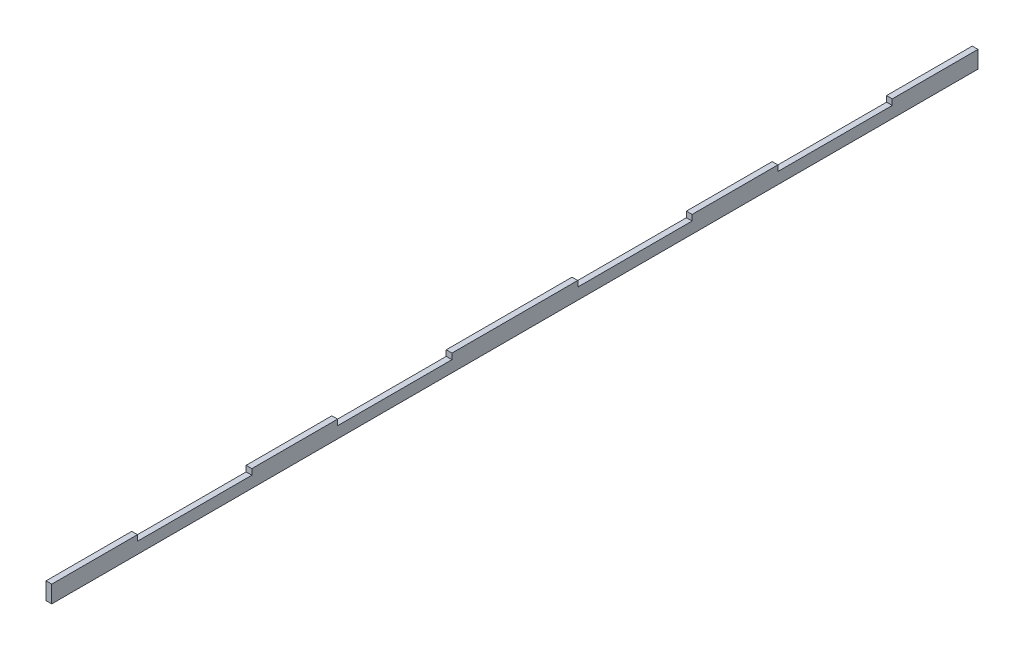
ISO-10303-21;
HEADER;
FILE_DESCRIPTION(('STEP AP214'),'2;1');
FILE_NAME('part.step','',(''),(''),'','','');
FILE_SCHEMA(('AUTOMOTIVE_DESIGN { 1 0 10303 214 1 1 1 1 }'));
ENDSEC;
DATA;
#1=APPLICATION_CONTEXT('core data for automotive mechanical design processes');
#2=APPLICATION_PROTOCOL_DEFINITION('international standard','automotive_design',2000,#1);
#3=PRODUCT_CONTEXT('',#1,'mechanical');
#4=PRODUCT('Part','Part','',(#3));
#5=PRODUCT_RELATED_PRODUCT_CATEGORY('part','',(#4));
#6=PRODUCT_DEFINITION_FORMATION('','',#4);
#7=PRODUCT_DEFINITION_CONTEXT('part definition',#1,'design');
#8=PRODUCT_DEFINITION('design','',#6,#7);
#9=PRODUCT_DEFINITION_SHAPE('','',#8);
#10=(LENGTH_UNIT() NAMED_UNIT(*) SI_UNIT(.MILLI.,.METRE.));
#11=(NAMED_UNIT(*) PLANE_ANGLE_UNIT() SI_UNIT($,.RADIAN.));
#12=(NAMED_UNIT(*) SI_UNIT($,.STERADIAN.) SOLID_ANGLE_UNIT());
#13=UNCERTAINTY_MEASURE_WITH_UNIT(LENGTH_MEASURE(1.E-05),#10,'distance_accuracy_value','');
#14=(GEOMETRIC_REPRESENTATION_CONTEXT(3) GLOBAL_UNCERTAINTY_ASSIGNED_CONTEXT((#13)) GLOBAL_UNIT_ASSIGNED_CONTEXT((#10,
#11,#12)) REPRESENTATION_CONTEXT('',''));
#15=CARTESIAN_POINT('',(0.,0.,0.));
#16=DIRECTION('',(0.,0.,1.));
#17=DIRECTION('',(1.,0.,0.));
#18=AXIS2_PLACEMENT_3D('',#15,#16,#17);
#19=CARTESIAN_POINT('',(2.,3.,162.));
#20=DIRECTION('',(0.,-1.,0.));
#21=DIRECTION('',(0.,0.,-1.));
#22=AXIS2_PLACEMENT_3D('',#19,#20,#21);
#23=PLANE('',#22);
#24=DIRECTION('',(0.,0.,1.));
#25=VECTOR('',#24,1.);
#26=CARTESIAN_POINT('',(2.,3.,162.));
#27=LINE('',#26,#25);
#28=CARTESIAN_POINT('',(2.,3.,132.));
#29=VERTEX_POINT('',#28);
#30=CARTESIAN_POINT('',(2.,3.,162.));
#31=VERTEX_POINT('',#30);
#32=EDGE_CURVE('E285',#29,#31,#27,.T.);
#33=ORIENTED_EDGE('',*,*,#32,.F.);
#34=DIRECTION('',(1.,0.,0.));
#35=VECTOR('',#34,1.);
#36=CARTESIAN_POINT('',(0.,3.,132.));
#37=LINE('',#36,#35);
#38=CARTESIAN_POINT('',(0.,3.,132.));
#39=VERTEX_POINT('',#38);
#40=EDGE_CURVE('E200',#39,#29,#37,.T.);
#41=ORIENTED_EDGE('',*,*,#40,.F.);
#42=DIRECTION('',(0.,0.,1.));
#43=VECTOR('',#42,1.);
#44=CARTESIAN_POINT('',(0.,3.,162.));
#45=LINE('',#44,#43);
#46=CARTESIAN_POINT('',(0.,3.,162.));
#47=VERTEX_POINT('',#46);
#48=EDGE_CURVE('E190',#39,#47,#45,.T.);
#49=ORIENTED_EDGE('',*,*,#48,.T.);
#50=DIRECTION('',(-1.,0.,0.));
#51=VECTOR('',#50,1.);
#52=CARTESIAN_POINT('',(2.,3.,162.));
#53=LINE('',#52,#51);
#54=EDGE_CURVE('E41',#31,#47,#53,.T.);
#55=ORIENTED_EDGE('',*,*,#54,.F.);
#56=EDGE_LOOP('',(#33,#41,#49,#55));
#57=FACE_BOUND('',#56,.T.);
#58=ADVANCED_FACE('F33',(#57),#23,.F.);
#59=CARTESIAN_POINT('',(0.,3.,62.));
#60=VERTEX_POINT('',#59);
#61=CARTESIAN_POINT('',(0.,3.,92.));
#62=VERTEX_POINT('',#61);
#63=EDGE_CURVE('E375',#60,#62,#45,.T.);
#64=ORIENTED_EDGE('',*,*,#63,.T.);
#65=DIRECTION('',(1.,0.,0.));
#66=VECTOR('',#65,1.);
#67=CARTESIAN_POINT('',(0.,3.,92.));
#68=LINE('',#67,#66);
#69=CARTESIAN_POINT('',(2.,3.,92.));
#70=VERTEX_POINT('',#69);
#71=EDGE_CURVE('E203',#62,#70,#68,.T.);
#72=ORIENTED_EDGE('',*,*,#71,.T.);
#73=CARTESIAN_POINT('',(2.,3.,62.));
#74=VERTEX_POINT('',#73);
#75=EDGE_CURVE('E329',#74,#70,#27,.T.);
#76=ORIENTED_EDGE('',*,*,#75,.F.);
#77=DIRECTION('',(1.,0.,0.));
#78=VECTOR('',#77,1.);
#79=CARTESIAN_POINT('',(0.,3.,62.));
#80=LINE('',#79,#78);
#81=EDGE_CURVE('E198',#60,#74,#80,.T.);
#82=ORIENTED_EDGE('',*,*,#81,.F.);
#83=EDGE_LOOP('',(#64,#72,#76,#82));
#84=FACE_BOUND('',#83,.T.);
#85=ADVANCED_FACE('F374',(#84),#23,.F.);
#86=CARTESIAN_POINT('',(0.,3.,-92.));
#87=VERTEX_POINT('',#86);
#88=CARTESIAN_POINT('',(0.,3.,-62.));
#89=VERTEX_POINT('',#88);
#90=EDGE_CURVE('E302',#87,#89,#45,.T.);
#91=ORIENTED_EDGE('',*,*,#90,.T.);
#92=DIRECTION('',(1.,0.,0.));
#93=VECTOR('',#92,1.);
#94=CARTESIAN_POINT('',(0.,3.,-62.));
#95=LINE('',#94,#93);
#96=CARTESIAN_POINT('',(2.,3.,-62.));
#97=VERTEX_POINT('',#96);
#98=EDGE_CURVE('E220',#89,#97,#95,.T.);
#99=ORIENTED_EDGE('',*,*,#98,.T.);
#100=CARTESIAN_POINT('',(2.,3.,-92.));
#101=VERTEX_POINT('',#100);
#102=EDGE_CURVE('E291',#101,#97,#27,.T.);
#103=ORIENTED_EDGE('',*,*,#102,.F.);
#104=DIRECTION('',(1.,0.,0.));
#105=VECTOR('',#104,1.);
#106=CARTESIAN_POINT('',(0.,3.,-92.));
#107=LINE('',#106,#105);
#108=EDGE_CURVE('E267',#87,#101,#107,.T.);
#109=ORIENTED_EDGE('',*,*,#108,.F.);
#110=EDGE_LOOP('',(#91,#99,#103,#109));
#111=FACE_BOUND('',#110,.T.);
#112=ADVANCED_FACE('F348',(#111),#23,.F.);
#113=CARTESIAN_POINT('',(0.,3.,-162.));
#114=VERTEX_POINT('',#113);
#115=CARTESIAN_POINT('',(0.,3.,-132.));
#116=VERTEX_POINT('',#115);
#117=EDGE_CURVE('E298',#114,#116,#45,.T.);
#118=ORIENTED_EDGE('',*,*,#117,.T.);
#119=DIRECTION('',(1.,0.,0.));
#120=VECTOR('',#119,1.);
#121=CARTESIAN_POINT('',(0.,3.,-132.));
#122=LINE('',#121,#120);
#123=CARTESIAN_POINT('',(2.,3.,-132.));
#124=VERTEX_POINT('',#123);
#125=EDGE_CURVE('E246',#116,#124,#122,.T.);
#126=ORIENTED_EDGE('',*,*,#125,.T.);
#127=CARTESIAN_POINT('',(2.,3.,-162.));
#128=VERTEX_POINT('',#127);
#129=EDGE_CURVE('E287',#128,#124,#27,.T.);
#130=ORIENTED_EDGE('',*,*,#129,.F.);
#131=DIRECTION('',(-1.,0.,0.));
#132=VECTOR('',#131,1.);
#133=CARTESIAN_POINT('',(2.,3.,-162.));
#134=LINE('',#133,#132);
#135=EDGE_CURVE('E11',#128,#114,#134,.T.);
#136=ORIENTED_EDGE('',*,*,#135,.T.);
#137=EDGE_LOOP('',(#118,#126,#130,#136));
#138=FACE_BOUND('',#137,.T.);
#139=ADVANCED_FACE('F383',(#138),#23,.F.);
#140=CARTESIAN_POINT('',(2.,-3.,-162.));
#141=DIRECTION('',(0.,0.,1.));
#142=DIRECTION('',(1.,0.,0.));
#143=AXIS2_PLACEMENT_3D('',#140,#141,#142);
#144=PLANE('',#143);
#145=DIRECTION('',(0.,1.,0.));
#146=VECTOR('',#145,1.);
#147=CARTESIAN_POINT('',(0.,-3.,-162.));
#148=LINE('',#147,#146);
#149=CARTESIAN_POINT('',(0.,-3.,-162.));
#150=VERTEX_POINT('',#149);
#151=EDGE_CURVE('E202',#150,#114,#148,.T.);
#152=ORIENTED_EDGE('',*,*,#151,.T.);
#153=ORIENTED_EDGE('',*,*,#135,.F.);
#154=DIRECTION('',(0.,1.,0.));
#155=VECTOR('',#154,1.);
#156=CARTESIAN_POINT('',(2.,-3.,-162.));
#157=LINE('',#156,#155);
#158=CARTESIAN_POINT('',(2.,-3.,-162.));
#159=VERTEX_POINT('',#158);
#160=EDGE_CURVE('E282',#159,#128,#157,.T.);
#161=ORIENTED_EDGE('',*,*,#160,.F.);
#162=DIRECTION('',(-1.,0.,0.));
#163=VECTOR('',#162,1.);
#164=CARTESIAN_POINT('',(2.,-3.,-162.));
#165=LINE('',#164,#163);
#166=EDGE_CURVE('E295',#159,#150,#165,.T.);
#167=ORIENTED_EDGE('',*,*,#166,.T.);
#168=EDGE_LOOP('',(#152,#153,#161,#167));
#169=FACE_BOUND('',#168,.T.);
#170=ADVANCED_FACE('F35',(#169),#144,.F.);
#171=CARTESIAN_POINT('',(0.,3.,-22.));
#172=VERTEX_POINT('',#171);
#173=CARTESIAN_POINT('',(0.,3.,22.));
#174=VERTEX_POINT('',#173);
#175=EDGE_CURVE('E363',#172,#174,#45,.T.);
#176=ORIENTED_EDGE('',*,*,#175,.T.);
#177=DIRECTION('',(1.,0.,0.));
#178=VECTOR('',#177,1.);
#179=CARTESIAN_POINT('',(0.,3.,22.));
#180=LINE('',#179,#178);
#181=CARTESIAN_POINT('',(2.,3.,22.));
#182=VERTEX_POINT('',#181);
#183=EDGE_CURVE('E225',#174,#182,#180,.T.);
#184=ORIENTED_EDGE('',*,*,#183,.T.);
#185=CARTESIAN_POINT('',(2.,3.,-22.));
#186=VERTEX_POINT('',#185);
#187=EDGE_CURVE('E331',#186,#182,#27,.T.);
#188=ORIENTED_EDGE('',*,*,#187,.F.);
#189=DIRECTION('',(1.,0.,0.));
#190=VECTOR('',#189,1.);
#191=CARTESIAN_POINT('',(0.,3.,-22.));
#192=LINE('',#191,#190);
#193=EDGE_CURVE('E241',#172,#186,#192,.T.);
#194=ORIENTED_EDGE('',*,*,#193,.F.);
#195=EDGE_LOOP('',(#176,#184,#188,#194));
#196=FACE_BOUND('',#195,.T.);
#197=ADVANCED_FACE('F362',(#196),#23,.F.);
#198=CARTESIAN_POINT('',(2.,-3.,162.));
#199=DIRECTION('',(0.,0.,-1.));
#200=DIRECTION('',(-1.,0.,0.));
#201=AXIS2_PLACEMENT_3D('',#198,#199,#200);
#202=PLANE('',#201);
#203=DIRECTION('',(0.,-1.,0.));
#204=VECTOR('',#203,1.);
#205=CARTESIAN_POINT('',(0.,-3.,162.));
#206=LINE('',#205,#204);
#207=CARTESIAN_POINT('',(0.,-3.,162.));
#208=VERTEX_POINT('',#207);
#209=EDGE_CURVE('E301',#47,#208,#206,.T.);
#210=ORIENTED_EDGE('',*,*,#209,.T.);
#211=DIRECTION('',(-1.,0.,0.));
#212=VECTOR('',#211,1.);
#213=CARTESIAN_POINT('',(2.,-3.,162.));
#214=LINE('',#213,#212);
#215=CARTESIAN_POINT('',(2.,-3.,162.));
#216=VERTEX_POINT('',#215);
#217=EDGE_CURVE('E307',#216,#208,#214,.T.);
#218=ORIENTED_EDGE('',*,*,#217,.F.);
#219=DIRECTION('',(0.,-1.,0.));
#220=VECTOR('',#219,1.);
#221=CARTESIAN_POINT('',(2.,-3.,162.));
#222=LINE('',#221,#220);
#223=EDGE_CURVE('E290',#31,#216,#222,.T.);
#224=ORIENTED_EDGE('',*,*,#223,.F.);
#225=ORIENTED_EDGE('',*,*,#54,.T.);
#226=EDGE_LOOP('',(#210,#218,#224,#225));
#227=FACE_BOUND('',#226,.T.);
#228=ADVANCED_FACE('F313',(#227),#202,.F.);
#229=CARTESIAN_POINT('',(2.,-3.,162.));
#230=DIRECTION('',(0.,1.,0.));
#231=DIRECTION('',(0.,0.,1.));
#232=AXIS2_PLACEMENT_3D('',#229,#230,#231);
#233=PLANE('',#232);
#234=DIRECTION('',(0.,0.,-1.));
#235=VECTOR('',#234,1.);
#236=CARTESIAN_POINT('',(0.,-3.,162.));
#237=LINE('',#236,#235);
#238=EDGE_CURVE('E286',#208,#150,#237,.T.);
#239=ORIENTED_EDGE('',*,*,#238,.T.);
#240=ORIENTED_EDGE('',*,*,#166,.F.);
#241=DIRECTION('',(0.,0.,-1.));
#242=VECTOR('',#241,1.);
#243=CARTESIAN_POINT('',(2.,-3.,162.));
#244=LINE('',#243,#242);
#245=EDGE_CURVE('E293',#216,#159,#244,.T.);
#246=ORIENTED_EDGE('',*,*,#245,.F.);
#247=ORIENTED_EDGE('',*,*,#217,.T.);
#248=EDGE_LOOP('',(#239,#240,#246,#247));
#249=FACE_BOUND('',#248,.T.);
#250=ADVANCED_FACE('F321',(#249),#233,.F.);
#251=CARTESIAN_POINT('',(2.,0.,0.));
#252=DIRECTION('',(-1.,0.,0.));
#253=DIRECTION('',(0.,0.,1.));
#254=AXIS2_PLACEMENT_3D('',#251,#252,#253);
#255=PLANE('',#254);
#256=DIRECTION('',(0.,0.,-1.));
#257=VECTOR('',#256,1.);
#258=CARTESIAN_POINT('',(2.,1.,132.));
#259=LINE('',#258,#257);
#260=CARTESIAN_POINT('',(2.,1.,132.));
#261=VERTEX_POINT('',#260);
#262=CARTESIAN_POINT('',(2.,1.,92.));
#263=VERTEX_POINT('',#262);
#264=EDGE_CURVE('E193',#261,#263,#259,.T.);
#265=ORIENTED_EDGE('',*,*,#264,.F.);
#266=DIRECTION('',(0.,-1.,0.));
#267=VECTOR('',#266,1.);
#268=CARTESIAN_POINT('',(2.,3.,132.));
#269=LINE('',#268,#267);
#270=EDGE_CURVE('E176',#29,#261,#269,.T.);
#271=ORIENTED_EDGE('',*,*,#270,.F.);
#272=ORIENTED_EDGE('',*,*,#32,.T.);
#273=ORIENTED_EDGE('',*,*,#223,.T.);
#274=ORIENTED_EDGE('',*,*,#245,.T.);
#275=ORIENTED_EDGE('',*,*,#160,.T.);
#276=ORIENTED_EDGE('',*,*,#129,.T.);
#277=DIRECTION('',(0.,1.,0.));
#278=VECTOR('',#277,1.);
#279=CARTESIAN_POINT('',(2.,3.,-132.));
#280=LINE('',#279,#278);
#281=CARTESIAN_POINT('',(2.,1.,-132.));
#282=VERTEX_POINT('',#281);
#283=EDGE_CURVE('E261',#282,#124,#280,.T.);
#284=ORIENTED_EDGE('',*,*,#283,.F.);
#285=DIRECTION('',(0.,0.,-1.));
#286=VECTOR('',#285,1.);
#287=CARTESIAN_POINT('',(2.,1.,-132.));
#288=LINE('',#287,#286);
#289=CARTESIAN_POINT('',(2.,1.,-92.));
#290=VERTEX_POINT('',#289);
#291=EDGE_CURVE('E271',#290,#282,#288,.T.);
#292=ORIENTED_EDGE('',*,*,#291,.F.);
#293=DIRECTION('',(0.,-1.,0.));
#294=VECTOR('',#293,1.);
#295=CARTESIAN_POINT('',(2.,3.,-92.));
#296=LINE('',#295,#294);
#297=EDGE_CURVE('E268',#101,#290,#296,.T.);
#298=ORIENTED_EDGE('',*,*,#297,.F.);
#299=ORIENTED_EDGE('',*,*,#102,.T.);
#300=DIRECTION('',(0.,1.,0.));
#301=VECTOR('',#300,1.);
#302=CARTESIAN_POINT('',(2.,3.,-62.));
#303=LINE('',#302,#301);
#304=CARTESIAN_POINT('',(2.,1.,-62.));
#305=VERTEX_POINT('',#304);
#306=EDGE_CURVE('E235',#305,#97,#303,.T.);
#307=ORIENTED_EDGE('',*,*,#306,.F.);
#308=DIRECTION('',(0.,0.,-1.));
#309=VECTOR('',#308,1.);
#310=CARTESIAN_POINT('',(2.,1.,-62.));
#311=LINE('',#310,#309);
#312=CARTESIAN_POINT('',(2.,1.,-22.));
#313=VERTEX_POINT('',#312);
#314=EDGE_CURVE('E245',#313,#305,#311,.T.);
#315=ORIENTED_EDGE('',*,*,#314,.F.);
#316=DIRECTION('',(0.,-1.,0.));
#317=VECTOR('',#316,1.);
#318=CARTESIAN_POINT('',(2.,3.,-22.));
#319=LINE('',#318,#317);
#320=EDGE_CURVE('E242',#186,#313,#319,.T.);
#321=ORIENTED_EDGE('',*,*,#320,.F.);
#322=ORIENTED_EDGE('',*,*,#187,.T.);
#323=DIRECTION('',(0.,1.,0.));
#324=VECTOR('',#323,1.);
#325=CARTESIAN_POINT('',(2.,3.,22.));
#326=LINE('',#325,#324);
#327=CARTESIAN_POINT('',(2.,1.,22.));
#328=VERTEX_POINT('',#327);
#329=EDGE_CURVE('E211',#328,#182,#326,.T.);
#330=ORIENTED_EDGE('',*,*,#329,.F.);
#331=DIRECTION('',(0.,0.,-1.));
#332=VECTOR('',#331,1.);
#333=CARTESIAN_POINT('',(2.,1.,62.));
#334=LINE('',#333,#332);
#335=CARTESIAN_POINT('',(2.,1.,62.));
#336=VERTEX_POINT('',#335);
#337=EDGE_CURVE('E219',#336,#328,#334,.T.);
#338=ORIENTED_EDGE('',*,*,#337,.F.);
#339=DIRECTION('',(0.,-1.,0.));
#340=VECTOR('',#339,1.);
#341=CARTESIAN_POINT('',(2.,3.,62.));
#342=LINE('',#341,#340);
#343=EDGE_CURVE('E216',#74,#336,#342,.T.);
#344=ORIENTED_EDGE('',*,*,#343,.F.);
#345=ORIENTED_EDGE('',*,*,#75,.T.);
#346=DIRECTION('',(0.,1.,0.));
#347=VECTOR('',#346,1.);
#348=CARTESIAN_POINT('',(2.,3.,92.));
#349=LINE('',#348,#347);
#350=EDGE_CURVE('E191',#263,#70,#349,.T.);
#351=ORIENTED_EDGE('',*,*,#350,.F.);
#352=EDGE_LOOP('',(#265,#271,#272,#273,#274,#275,#276,#284,#292,#298,#299,#307,#315,#321,#322,
#330,#338,#344,#345,#351));
#353=FACE_BOUND('',#352,.T.);
#354=ADVANCED_FACE('F327',(#353),#255,.F.);
#355=CARTESIAN_POINT('',(0.,0.,0.));
#356=DIRECTION('',(-1.,0.,0.));
#357=DIRECTION('',(0.,0.,1.));
#358=AXIS2_PLACEMENT_3D('',#355,#356,#357);
#359=PLANE('',#358);
#360=DIRECTION('',(0.,-1.,0.));
#361=VECTOR('',#360,1.);
#362=CARTESIAN_POINT('',(0.,3.,132.));
#363=LINE('',#362,#361);
#364=CARTESIAN_POINT('',(0.,1.,132.));
#365=VERTEX_POINT('',#364);
#366=EDGE_CURVE('E173',#39,#365,#363,.T.);
#367=ORIENTED_EDGE('',*,*,#366,.T.);
#368=DIRECTION('',(0.,0.,-1.));
#369=VECTOR('',#368,1.);
#370=CARTESIAN_POINT('',(0.,1.,132.));
#371=LINE('',#370,#369);
#372=CARTESIAN_POINT('',(0.,1.,92.));
#373=VERTEX_POINT('',#372);
#374=EDGE_CURVE('E183',#365,#373,#371,.T.);
#375=ORIENTED_EDGE('',*,*,#374,.T.);
#376=DIRECTION('',(0.,1.,0.));
#377=VECTOR('',#376,1.);
#378=CARTESIAN_POINT('',(0.,3.,92.));
#379=LINE('',#378,#377);
#380=EDGE_CURVE('E48',#373,#62,#379,.T.);
#381=ORIENTED_EDGE('',*,*,#380,.T.);
#382=ORIENTED_EDGE('',*,*,#63,.F.);
#383=DIRECTION('',(0.,-1.,0.));
#384=VECTOR('',#383,1.);
#385=CARTESIAN_POINT('',(0.,3.,62.));
#386=LINE('',#385,#384);
#387=CARTESIAN_POINT('',(0.,1.,62.));
#388=VERTEX_POINT('',#387);
#389=EDGE_CURVE('E207',#60,#388,#386,.T.);
#390=ORIENTED_EDGE('',*,*,#389,.T.);
#391=DIRECTION('',(0.,0.,-1.));
#392=VECTOR('',#391,1.);
#393=CARTESIAN_POINT('',(0.,1.,62.));
#394=LINE('',#393,#392);
#395=CARTESIAN_POINT('',(0.,1.,22.));
#396=VERTEX_POINT('',#395);
#397=EDGE_CURVE('E210',#388,#396,#394,.T.);
#398=ORIENTED_EDGE('',*,*,#397,.T.);
#399=DIRECTION('',(0.,1.,0.));
#400=VECTOR('',#399,1.);
#401=CARTESIAN_POINT('',(0.,3.,22.));
#402=LINE('',#401,#400);
#403=EDGE_CURVE('E56',#396,#174,#402,.T.);
#404=ORIENTED_EDGE('',*,*,#403,.T.);
#405=ORIENTED_EDGE('',*,*,#175,.F.);
#406=DIRECTION('',(0.,-1.,0.));
#407=VECTOR('',#406,1.);
#408=CARTESIAN_POINT('',(0.,3.,-22.));
#409=LINE('',#408,#407);
#410=CARTESIAN_POINT('',(0.,1.,-22.));
#411=VERTEX_POINT('',#410);
#412=EDGE_CURVE('E231',#172,#411,#409,.T.);
#413=ORIENTED_EDGE('',*,*,#412,.T.);
#414=DIRECTION('',(0.,0.,-1.));
#415=VECTOR('',#414,1.);
#416=CARTESIAN_POINT('',(0.,1.,-62.));
#417=LINE('',#416,#415);
#418=CARTESIAN_POINT('',(0.,1.,-62.));
#419=VERTEX_POINT('',#418);
#420=EDGE_CURVE('E234',#411,#419,#417,.T.);
#421=ORIENTED_EDGE('',*,*,#420,.T.);
#422=DIRECTION('',(0.,1.,0.));
#423=VECTOR('',#422,1.);
#424=CARTESIAN_POINT('',(0.,3.,-62.));
#425=LINE('',#424,#423);
#426=EDGE_CURVE('E238',#419,#89,#425,.T.);
#427=ORIENTED_EDGE('',*,*,#426,.T.);
#428=ORIENTED_EDGE('',*,*,#90,.F.);
#429=DIRECTION('',(0.,-1.,0.));
#430=VECTOR('',#429,1.);
#431=CARTESIAN_POINT('',(0.,3.,-92.));
#432=LINE('',#431,#430);
#433=CARTESIAN_POINT('',(0.,1.,-92.));
#434=VERTEX_POINT('',#433);
#435=EDGE_CURVE('E257',#87,#434,#432,.T.);
#436=ORIENTED_EDGE('',*,*,#435,.T.);
#437=DIRECTION('',(0.,0.,-1.));
#438=VECTOR('',#437,1.);
#439=CARTESIAN_POINT('',(0.,1.,-132.));
#440=LINE('',#439,#438);
#441=CARTESIAN_POINT('',(0.,1.,-132.));
#442=VERTEX_POINT('',#441);
#443=EDGE_CURVE('E260',#434,#442,#440,.T.);
#444=ORIENTED_EDGE('',*,*,#443,.T.);
#445=DIRECTION('',(0.,1.,0.));
#446=VECTOR('',#445,1.);
#447=CARTESIAN_POINT('',(0.,3.,-132.));
#448=LINE('',#447,#446);
#449=EDGE_CURVE('E264',#442,#116,#448,.T.);
#450=ORIENTED_EDGE('',*,*,#449,.T.);
#451=ORIENTED_EDGE('',*,*,#117,.F.);
#452=ORIENTED_EDGE('',*,*,#151,.F.);
#453=ORIENTED_EDGE('',*,*,#238,.F.);
#454=ORIENTED_EDGE('',*,*,#209,.F.);
#455=ORIENTED_EDGE('',*,*,#48,.F.);
#456=EDGE_LOOP('',(#367,#375,#381,#382,#390,#398,#404,#405,#413,#421,#427,#428,#436,#444,#450,
#451,#452,#453,#454,#455));
#457=FACE_BOUND('',#456,.T.);
#458=ADVANCED_FACE('F188',(#457),#359,.T.);
#459=CARTESIAN_POINT('',(0.,3.,-132.));
#460=DIRECTION('',(0.,0.,-1.));
#461=DIRECTION('',(-1.,0.,0.));
#462=AXIS2_PLACEMENT_3D('',#459,#460,#461);
#463=PLANE('',#462);
#464=ORIENTED_EDGE('',*,*,#283,.T.);
#465=ORIENTED_EDGE('',*,*,#125,.F.);
#466=ORIENTED_EDGE('',*,*,#449,.F.);
#467=DIRECTION('',(1.,0.,0.));
#468=VECTOR('',#467,1.);
#469=CARTESIAN_POINT('',(0.,1.,-132.));
#470=LINE('',#469,#468);
#471=EDGE_CURVE('E277',#442,#282,#470,.T.);
#472=ORIENTED_EDGE('',*,*,#471,.T.);
#473=EDGE_LOOP('',(#464,#465,#466,#472));
#474=FACE_BOUND('',#473,.T.);
#475=ADVANCED_FACE('F395',(#474),#463,.F.);
#476=CARTESIAN_POINT('',(0.,1.,-132.));
#477=DIRECTION('',(0.,-1.,0.));
#478=DIRECTION('',(0.,0.,-1.));
#479=AXIS2_PLACEMENT_3D('',#476,#477,#478);
#480=PLANE('',#479);
#481=ORIENTED_EDGE('',*,*,#291,.T.);
#482=ORIENTED_EDGE('',*,*,#471,.F.);
#483=ORIENTED_EDGE('',*,*,#443,.F.);
#484=DIRECTION('',(1.,0.,0.));
#485=VECTOR('',#484,1.);
#486=CARTESIAN_POINT('',(0.,1.,-92.));
#487=LINE('',#486,#485);
#488=EDGE_CURVE('E279',#434,#290,#487,.T.);
#489=ORIENTED_EDGE('',*,*,#488,.T.);
#490=EDGE_LOOP('',(#481,#482,#483,#489));
#491=FACE_BOUND('',#490,.T.);
#492=ADVANCED_FACE('F397',(#491),#480,.F.);
#493=CARTESIAN_POINT('',(0.,3.,-92.));
#494=DIRECTION('',(0.,0.,1.));
#495=DIRECTION('',(1.,0.,0.));
#496=AXIS2_PLACEMENT_3D('',#493,#494,#495);
#497=PLANE('',#496);
#498=ORIENTED_EDGE('',*,*,#297,.T.);
#499=ORIENTED_EDGE('',*,*,#488,.F.);
#500=ORIENTED_EDGE('',*,*,#435,.F.);
#501=ORIENTED_EDGE('',*,*,#108,.T.);
#502=EDGE_LOOP('',(#498,#499,#500,#501));
#503=FACE_BOUND('',#502,.T.);
#504=ADVANCED_FACE('F400',(#503),#497,.F.);
#505=CARTESIAN_POINT('',(0.,3.,-62.));
#506=DIRECTION('',(0.,0.,-1.));
#507=DIRECTION('',(-1.,0.,0.));
#508=AXIS2_PLACEMENT_3D('',#505,#506,#507);
#509=PLANE('',#508);
#510=ORIENTED_EDGE('',*,*,#306,.T.);
#511=ORIENTED_EDGE('',*,*,#98,.F.);
#512=ORIENTED_EDGE('',*,*,#426,.F.);
#513=DIRECTION('',(1.,0.,0.));
#514=VECTOR('',#513,1.);
#515=CARTESIAN_POINT('',(0.,1.,-62.));
#516=LINE('',#515,#514);
#517=EDGE_CURVE('E252',#419,#305,#516,.T.);
#518=ORIENTED_EDGE('',*,*,#517,.T.);
#519=EDGE_LOOP('',(#510,#511,#512,#518));
#520=FACE_BOUND('',#519,.T.);
#521=ADVANCED_FACE('F352',(#520),#509,.F.);
#522=CARTESIAN_POINT('',(0.,1.,-62.));
#523=DIRECTION('',(0.,-1.,0.));
#524=DIRECTION('',(0.,0.,-1.));
#525=AXIS2_PLACEMENT_3D('',#522,#523,#524);
#526=PLANE('',#525);
#527=ORIENTED_EDGE('',*,*,#314,.T.);
#528=ORIENTED_EDGE('',*,*,#517,.F.);
#529=ORIENTED_EDGE('',*,*,#420,.F.);
#530=DIRECTION('',(1.,0.,0.));
#531=VECTOR('',#530,1.);
#532=CARTESIAN_POINT('',(0.,1.,-22.));
#533=LINE('',#532,#531);
#534=EDGE_CURVE('E254',#411,#313,#533,.T.);
#535=ORIENTED_EDGE('',*,*,#534,.T.);
#536=EDGE_LOOP('',(#527,#528,#529,#535));
#537=FACE_BOUND('',#536,.T.);
#538=ADVANCED_FACE('F356',(#537),#526,.F.);
#539=CARTESIAN_POINT('',(0.,3.,-22.));
#540=DIRECTION('',(0.,0.,1.));
#541=DIRECTION('',(1.,0.,0.));
#542=AXIS2_PLACEMENT_3D('',#539,#540,#541);
#543=PLANE('',#542);
#544=ORIENTED_EDGE('',*,*,#320,.T.);
#545=ORIENTED_EDGE('',*,*,#534,.F.);
#546=ORIENTED_EDGE('',*,*,#412,.F.);
#547=ORIENTED_EDGE('',*,*,#193,.T.);
#548=EDGE_LOOP('',(#544,#545,#546,#547));
#549=FACE_BOUND('',#548,.T.);
#550=ADVANCED_FACE('F358',(#549),#543,.F.);
#551=CARTESIAN_POINT('',(0.,3.,62.));
#552=DIRECTION('',(0.,0.,1.));
#553=DIRECTION('',(1.,0.,0.));
#554=AXIS2_PLACEMENT_3D('',#551,#552,#553);
#555=PLANE('',#554);
#556=ORIENTED_EDGE('',*,*,#343,.T.);
#557=DIRECTION('',(1.,0.,0.));
#558=VECTOR('',#557,1.);
#559=CARTESIAN_POINT('',(0.,1.,62.));
#560=LINE('',#559,#558);
#561=EDGE_CURVE('E215',#388,#336,#560,.T.);
#562=ORIENTED_EDGE('',*,*,#561,.F.);
#563=ORIENTED_EDGE('',*,*,#389,.F.);
#564=ORIENTED_EDGE('',*,*,#81,.T.);
#565=EDGE_LOOP('',(#556,#562,#563,#564));
#566=FACE_BOUND('',#565,.T.);
#567=ADVANCED_FACE('F464',(#566),#555,.F.);
#568=CARTESIAN_POINT('',(0.,3.,22.));
#569=DIRECTION('',(0.,0.,-1.));
#570=DIRECTION('',(-1.,0.,0.));
#571=AXIS2_PLACEMENT_3D('',#568,#569,#570);
#572=PLANE('',#571);
#573=ORIENTED_EDGE('',*,*,#329,.T.);
#574=ORIENTED_EDGE('',*,*,#183,.F.);
#575=ORIENTED_EDGE('',*,*,#403,.F.);
#576=DIRECTION('',(1.,0.,0.));
#577=VECTOR('',#576,1.);
#578=CARTESIAN_POINT('',(0.,1.,22.));
#579=LINE('',#578,#577);
#580=EDGE_CURVE('E228',#396,#328,#579,.T.);
#581=ORIENTED_EDGE('',*,*,#580,.T.);
#582=EDGE_LOOP('',(#573,#574,#575,#581));
#583=FACE_BOUND('',#582,.T.);
#584=ADVANCED_FACE('F364',(#583),#572,.F.);
#585=CARTESIAN_POINT('',(0.,1.,62.));
#586=DIRECTION('',(0.,-1.,0.));
#587=DIRECTION('',(0.,0.,-1.));
#588=AXIS2_PLACEMENT_3D('',#585,#586,#587);
#589=PLANE('',#588);
#590=ORIENTED_EDGE('',*,*,#337,.T.);
#591=ORIENTED_EDGE('',*,*,#580,.F.);
#592=ORIENTED_EDGE('',*,*,#397,.F.);
#593=ORIENTED_EDGE('',*,*,#561,.T.);
#594=EDGE_LOOP('',(#590,#591,#592,#593));
#595=FACE_BOUND('',#594,.T.);
#596=ADVANCED_FACE('F368',(#595),#589,.F.);
#597=CARTESIAN_POINT('',(0.,3.,132.));
#598=DIRECTION('',(0.,0.,1.));
#599=DIRECTION('',(1.,0.,0.));
#600=AXIS2_PLACEMENT_3D('',#597,#598,#599);
#601=PLANE('',#600);
#602=ORIENTED_EDGE('',*,*,#270,.T.);
#603=DIRECTION('',(1.,0.,0.));
#604=VECTOR('',#603,1.);
#605=CARTESIAN_POINT('',(0.,1.,132.));
#606=LINE('',#605,#604);
#607=EDGE_CURVE('E169',#365,#261,#606,.T.);
#608=ORIENTED_EDGE('',*,*,#607,.F.);
#609=ORIENTED_EDGE('',*,*,#366,.F.);
#610=ORIENTED_EDGE('',*,*,#40,.T.);
#611=EDGE_LOOP('',(#602,#608,#609,#610));
#612=FACE_BOUND('',#611,.T.);
#613=ADVANCED_FACE('F171',(#612),#601,.F.);
#614=CARTESIAN_POINT('',(0.,3.,92.));
#615=DIRECTION('',(0.,0.,-1.));
#616=DIRECTION('',(-1.,0.,0.));
#617=AXIS2_PLACEMENT_3D('',#614,#615,#616);
#618=PLANE('',#617);
#619=ORIENTED_EDGE('',*,*,#350,.T.);
#620=ORIENTED_EDGE('',*,*,#71,.F.);
#621=ORIENTED_EDGE('',*,*,#380,.F.);
#622=DIRECTION('',(1.,0.,0.));
#623=VECTOR('',#622,1.);
#624=CARTESIAN_POINT('',(0.,1.,92.));
#625=LINE('',#624,#623);
#626=EDGE_CURVE('E180',#373,#263,#625,.T.);
#627=ORIENTED_EDGE('',*,*,#626,.T.);
#628=EDGE_LOOP('',(#619,#620,#621,#627));
#629=FACE_BOUND('',#628,.T.);
#630=ADVANCED_FACE('F376',(#629),#618,.F.);
#631=CARTESIAN_POINT('',(0.,1.,132.));
#632=DIRECTION('',(0.,-1.,0.));
#633=DIRECTION('',(0.,0.,-1.));
#634=AXIS2_PLACEMENT_3D('',#631,#632,#633);
#635=PLANE('',#634);
#636=ORIENTED_EDGE('',*,*,#264,.T.);
#637=ORIENTED_EDGE('',*,*,#626,.F.);
#638=ORIENTED_EDGE('',*,*,#374,.F.);
#639=ORIENTED_EDGE('',*,*,#607,.T.);
#640=EDGE_LOOP('',(#636,#637,#638,#639));
#641=FACE_BOUND('',#640,.T.);
#642=ADVANCED_FACE('F184',(#641),#635,.F.);
#643=CLOSED_SHELL('',(#58,#85,#112,#139,#170,#197,#228,#250,#354,#458,#475,#492,#504,#521,#538,
#550,#567,#584,#596,#613,#630,#642));
#644=MANIFOLD_SOLID_BREP('B2',#643);
#645=ADVANCED_BREP_SHAPE_REPRESENTATION('',(#18,#644),#14);
#646=SHAPE_DEFINITION_REPRESENTATION(#9,#645);
ENDSEC;
END-ISO-10303-21;
